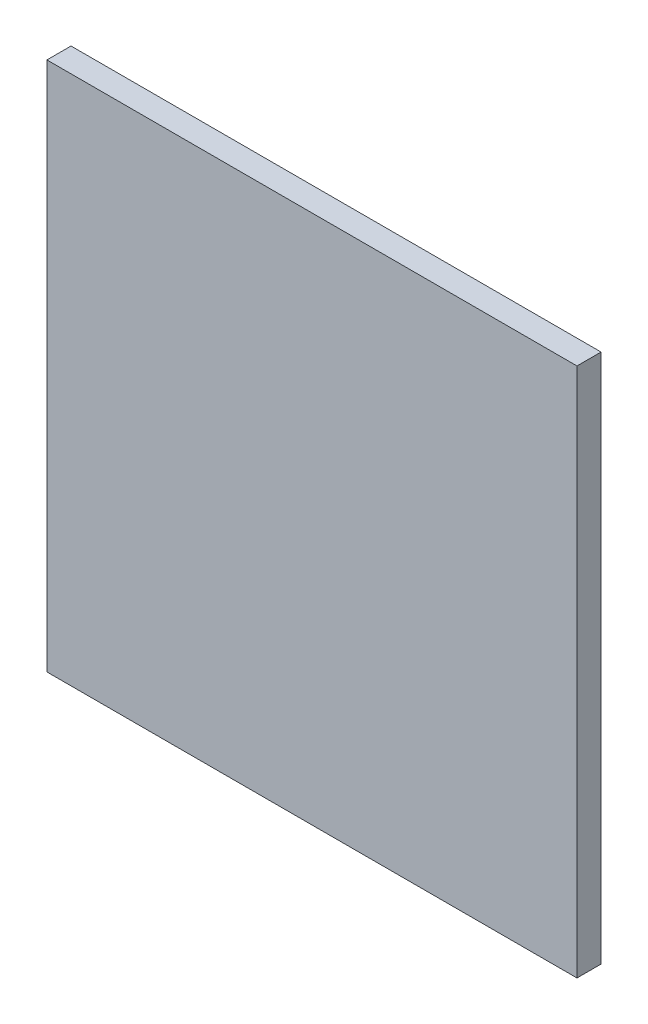
ISO-10303-21;
HEADER;
FILE_DESCRIPTION(('STEP AP214'),'2;1');
FILE_NAME('part.step','',(''),(''),'','','');
FILE_SCHEMA(('AUTOMOTIVE_DESIGN { 1 0 10303 214 1 1 1 1 }'));
ENDSEC;
DATA;
#1=APPLICATION_CONTEXT('core data for automotive mechanical design processes');
#2=APPLICATION_PROTOCOL_DEFINITION('international standard','automotive_design',2000,#1);
#3=PRODUCT_CONTEXT('',#1,'mechanical');
#4=PRODUCT('Part','Part','',(#3));
#5=PRODUCT_RELATED_PRODUCT_CATEGORY('part','',(#4));
#6=PRODUCT_DEFINITION_FORMATION('','',#4);
#7=PRODUCT_DEFINITION_CONTEXT('part definition',#1,'design');
#8=PRODUCT_DEFINITION('design','',#6,#7);
#9=PRODUCT_DEFINITION_SHAPE('','',#8);
#10=(LENGTH_UNIT() NAMED_UNIT(*) SI_UNIT(.MILLI.,.METRE.));
#11=(NAMED_UNIT(*) PLANE_ANGLE_UNIT() SI_UNIT($,.RADIAN.));
#12=(NAMED_UNIT(*) SI_UNIT($,.STERADIAN.) SOLID_ANGLE_UNIT());
#13=UNCERTAINTY_MEASURE_WITH_UNIT(LENGTH_MEASURE(1.E-05),#10,'distance_accuracy_value','');
#14=(GEOMETRIC_REPRESENTATION_CONTEXT(3) GLOBAL_UNCERTAINTY_ASSIGNED_CONTEXT((#13)) GLOBAL_UNIT_ASSIGNED_CONTEXT((#10,
#11,#12)) REPRESENTATION_CONTEXT('',''));
#15=CARTESIAN_POINT('',(0.,0.,0.));
#16=DIRECTION('',(0.,0.,1.));
#17=DIRECTION('',(1.,0.,0.));
#18=AXIS2_PLACEMENT_3D('',#15,#16,#17);
#19=CARTESIAN_POINT('',(55.,-55.,2.5));
#20=DIRECTION('',(-1.,0.,0.));
#21=DIRECTION('',(0.,0.,1.));
#22=AXIS2_PLACEMENT_3D('',#19,#20,#21);
#23=PLANE('',#22);
#24=DIRECTION('',(0.,1.,0.));
#25=VECTOR('',#24,1.);
#26=CARTESIAN_POINT('',(55.,-55.,-2.5));
#27=LINE('',#26,#25);
#28=CARTESIAN_POINT('',(55.,-55.,-2.5));
#29=VERTEX_POINT('',#28);
#30=CARTESIAN_POINT('',(55.,55.,-2.5));
#31=VERTEX_POINT('',#30);
#32=EDGE_CURVE('E98',#29,#31,#27,.T.);
#33=ORIENTED_EDGE('',*,*,#32,.T.);
#34=DIRECTION('',(0.,0.,-1.));
#35=VECTOR('',#34,1.);
#36=CARTESIAN_POINT('',(55.,55.,2.5));
#37=LINE('',#36,#35);
#38=CARTESIAN_POINT('',(55.,55.,2.5));
#39=VERTEX_POINT('',#38);
#40=EDGE_CURVE('E11',#39,#31,#37,.T.);
#41=ORIENTED_EDGE('',*,*,#40,.F.);
#42=DIRECTION('',(0.,1.,0.));
#43=VECTOR('',#42,1.);
#44=CARTESIAN_POINT('',(55.,-55.,2.5));
#45=LINE('',#44,#43);
#46=CARTESIAN_POINT('',(55.,-55.,2.5));
#47=VERTEX_POINT('',#46);
#48=EDGE_CURVE('E86',#47,#39,#45,.T.);
#49=ORIENTED_EDGE('',*,*,#48,.F.);
#50=DIRECTION('',(0.,0.,-1.));
#51=VECTOR('',#50,1.);
#52=CARTESIAN_POINT('',(55.,-55.,2.5));
#53=LINE('',#52,#51);
#54=EDGE_CURVE('E94',#47,#29,#53,.T.);
#55=ORIENTED_EDGE('',*,*,#54,.T.);
#56=EDGE_LOOP('',(#33,#41,#49,#55));
#57=FACE_BOUND('',#56,.T.);
#58=ADVANCED_FACE('F35',(#57),#23,.F.);
#59=CARTESIAN_POINT('',(-55.,55.,2.5));
#60=DIRECTION('',(0.,-1.,0.));
#61=DIRECTION('',(1.,0.,0.));
#62=AXIS2_PLACEMENT_3D('',#59,#60,#61);
#63=PLANE('',#62);
#64=DIRECTION('',(-1.,0.,0.));
#65=VECTOR('',#64,1.);
#66=CARTESIAN_POINT('',(-55.,55.,-2.5));
#67=LINE('',#66,#65);
#68=CARTESIAN_POINT('',(-55.,55.,-2.5));
#69=VERTEX_POINT('',#68);
#70=EDGE_CURVE('E90',#31,#69,#67,.T.);
#71=ORIENTED_EDGE('',*,*,#70,.T.);
#72=DIRECTION('',(0.,0.,-1.));
#73=VECTOR('',#72,1.);
#74=CARTESIAN_POINT('',(-55.,55.,2.5));
#75=LINE('',#74,#73);
#76=CARTESIAN_POINT('',(-55.,55.,2.5));
#77=VERTEX_POINT('',#76);
#78=EDGE_CURVE('E43',#77,#69,#75,.T.);
#79=ORIENTED_EDGE('',*,*,#78,.F.);
#80=DIRECTION('',(-1.,0.,0.));
#81=VECTOR('',#80,1.);
#82=CARTESIAN_POINT('',(-55.,55.,2.5));
#83=LINE('',#82,#81);
#84=EDGE_CURVE('E81',#39,#77,#83,.T.);
#85=ORIENTED_EDGE('',*,*,#84,.F.);
#86=ORIENTED_EDGE('',*,*,#40,.T.);
#87=EDGE_LOOP('',(#71,#79,#85,#86));
#88=FACE_BOUND('',#87,.T.);
#89=ADVANCED_FACE('F89',(#88),#63,.F.);
#90=CARTESIAN_POINT('',(-55.,-55.,2.5));
#91=DIRECTION('',(1.,0.,0.));
#92=DIRECTION('',(0.,1.,0.));
#93=AXIS2_PLACEMENT_3D('',#90,#91,#92);
#94=PLANE('',#93);
#95=DIRECTION('',(0.,-1.,0.));
#96=VECTOR('',#95,1.);
#97=CARTESIAN_POINT('',(-55.,-55.,-2.5));
#98=LINE('',#97,#96);
#99=CARTESIAN_POINT('',(-55.,-55.,-2.5));
#100=VERTEX_POINT('',#99);
#101=EDGE_CURVE('E68',#69,#100,#98,.T.);
#102=ORIENTED_EDGE('',*,*,#101,.T.);
#103=DIRECTION('',(0.,0.,-1.));
#104=VECTOR('',#103,1.);
#105=CARTESIAN_POINT('',(-55.,-55.,2.5));
#106=LINE('',#105,#104);
#107=CARTESIAN_POINT('',(-55.,-55.,2.5));
#108=VERTEX_POINT('',#107);
#109=EDGE_CURVE('E91',#108,#100,#106,.T.);
#110=ORIENTED_EDGE('',*,*,#109,.F.);
#111=DIRECTION('',(0.,-1.,0.));
#112=VECTOR('',#111,1.);
#113=CARTESIAN_POINT('',(-55.,-55.,2.5));
#114=LINE('',#113,#112);
#115=EDGE_CURVE('E84',#77,#108,#114,.T.);
#116=ORIENTED_EDGE('',*,*,#115,.F.);
#117=ORIENTED_EDGE('',*,*,#78,.T.);
#118=EDGE_LOOP('',(#102,#110,#116,#117));
#119=FACE_BOUND('',#118,.T.);
#120=ADVANCED_FACE('F92',(#119),#94,.F.);
#121=CARTESIAN_POINT('',(-55.,-55.,2.5));
#122=DIRECTION('',(0.,1.,0.));
#123=DIRECTION('',(-1.,0.,0.));
#124=AXIS2_PLACEMENT_3D('',#121,#122,#123);
#125=PLANE('',#124);
#126=DIRECTION('',(1.,0.,0.));
#127=VECTOR('',#126,1.);
#128=CARTESIAN_POINT('',(-55.,-55.,-2.5));
#129=LINE('',#128,#127);
#130=EDGE_CURVE('E74',#100,#29,#129,.T.);
#131=ORIENTED_EDGE('',*,*,#130,.T.);
#132=ORIENTED_EDGE('',*,*,#54,.F.);
#133=DIRECTION('',(1.,0.,0.));
#134=VECTOR('',#133,1.);
#135=CARTESIAN_POINT('',(-55.,-55.,2.5));
#136=LINE('',#135,#134);
#137=EDGE_CURVE('E51',#108,#47,#136,.T.);
#138=ORIENTED_EDGE('',*,*,#137,.F.);
#139=ORIENTED_EDGE('',*,*,#109,.T.);
#140=EDGE_LOOP('',(#131,#132,#138,#139));
#141=FACE_BOUND('',#140,.T.);
#142=ADVANCED_FACE('F105',(#141),#125,.F.);
#143=CARTESIAN_POINT('',(0.,0.,2.5));
#144=DIRECTION('',(0.,0.,-1.));
#145=DIRECTION('',(-1.,0.,0.));
#146=AXIS2_PLACEMENT_3D('',#143,#144,#145);
#147=PLANE('',#146);
#148=ORIENTED_EDGE('',*,*,#48,.T.);
#149=ORIENTED_EDGE('',*,*,#84,.T.);
#150=ORIENTED_EDGE('',*,*,#115,.T.);
#151=ORIENTED_EDGE('',*,*,#137,.T.);
#152=EDGE_LOOP('',(#148,#149,#150,#151));
#153=FACE_BOUND('',#152,.T.);
#154=ADVANCED_FACE('F82',(#153),#147,.F.);
#155=CARTESIAN_POINT('',(0.,0.,-2.5));
#156=DIRECTION('',(0.,0.,-1.));
#157=DIRECTION('',(-1.,0.,0.));
#158=AXIS2_PLACEMENT_3D('',#155,#156,#157);
#159=PLANE('',#158);
#160=ORIENTED_EDGE('',*,*,#32,.F.);
#161=ORIENTED_EDGE('',*,*,#130,.F.);
#162=ORIENTED_EDGE('',*,*,#101,.F.);
#163=ORIENTED_EDGE('',*,*,#70,.F.);
#164=EDGE_LOOP('',(#160,#161,#162,#163));
#165=FACE_BOUND('',#164,.T.);
#166=ADVANCED_FACE('F108',(#165),#159,.T.);
#167=CLOSED_SHELL('',(#58,#89,#120,#142,#154,#166));
#168=MANIFOLD_SOLID_BREP('B2',#167);
#169=ADVANCED_BREP_SHAPE_REPRESENTATION('',(#18,#168),#14);
#170=SHAPE_DEFINITION_REPRESENTATION(#9,#169);
ENDSEC;
END-ISO-10303-21;
